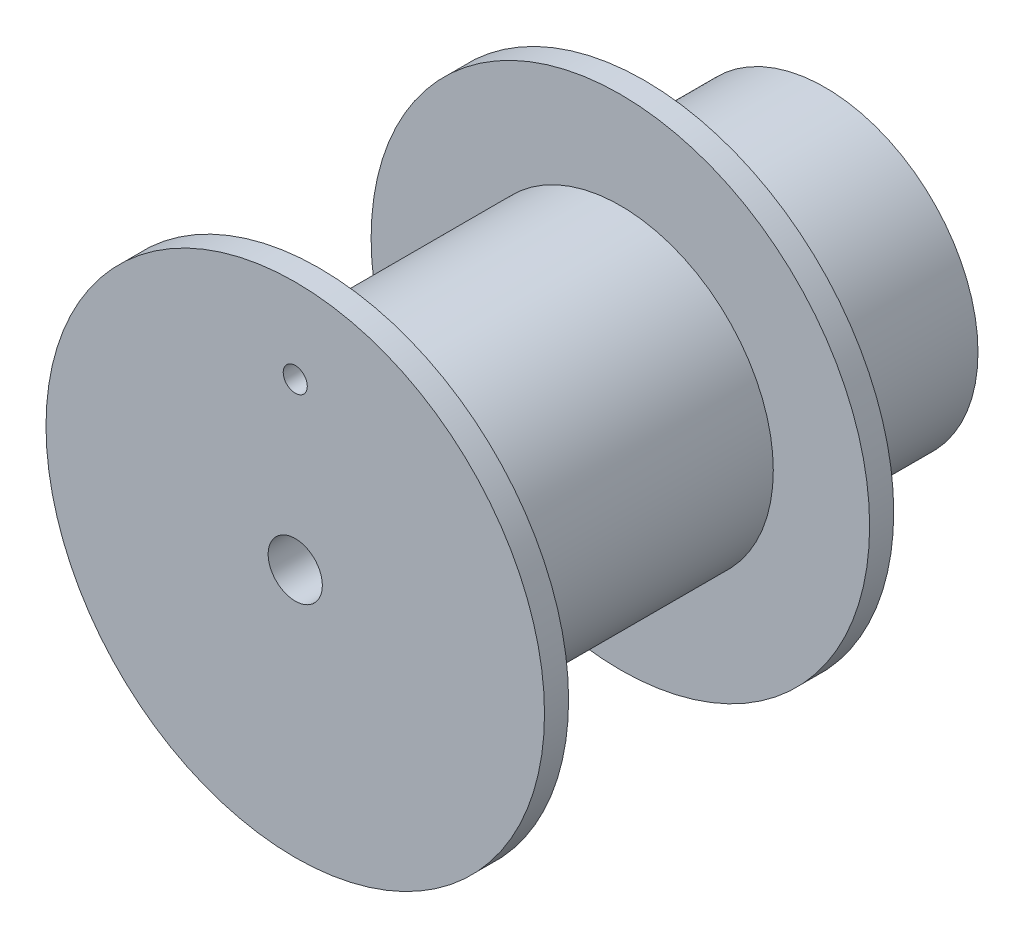
ISO-10303-21;
HEADER;
FILE_DESCRIPTION(('STEP AP214'),'2;1');
FILE_NAME('part.step','',(''),(''),'','','');
FILE_SCHEMA(('AUTOMOTIVE_DESIGN { 1 0 10303 214 1 1 1 1 }'));
ENDSEC;
DATA;
#1=APPLICATION_CONTEXT('core data for automotive mechanical design processes');
#2=APPLICATION_PROTOCOL_DEFINITION('international standard','automotive_design',2000,#1);
#3=PRODUCT_CONTEXT('',#1,'mechanical');
#4=PRODUCT('Part','Part','',(#3));
#5=PRODUCT_RELATED_PRODUCT_CATEGORY('part','',(#4));
#6=PRODUCT_DEFINITION_FORMATION('','',#4);
#7=PRODUCT_DEFINITION_CONTEXT('part definition',#1,'design');
#8=PRODUCT_DEFINITION('design','',#6,#7);
#9=PRODUCT_DEFINITION_SHAPE('','',#8);
#10=(LENGTH_UNIT() NAMED_UNIT(*) SI_UNIT(.MILLI.,.METRE.));
#11=(NAMED_UNIT(*) PLANE_ANGLE_UNIT() SI_UNIT($,.RADIAN.));
#12=(NAMED_UNIT(*) SI_UNIT($,.STERADIAN.) SOLID_ANGLE_UNIT());
#13=UNCERTAINTY_MEASURE_WITH_UNIT(LENGTH_MEASURE(1.E-05),#10,'distance_accuracy_value','');
#14=(GEOMETRIC_REPRESENTATION_CONTEXT(3) GLOBAL_UNCERTAINTY_ASSIGNED_CONTEXT((#13)) GLOBAL_UNIT_ASSIGNED_CONTEXT((#10,
#11,#12)) REPRESENTATION_CONTEXT('',''));
#15=CARTESIAN_POINT('',(0.,0.,0.));
#16=DIRECTION('',(0.,0.,1.));
#17=DIRECTION('',(1.,0.,0.));
#18=AXIS2_PLACEMENT_3D('',#15,#16,#17);
#19=CARTESIAN_POINT('',(0.,0.,28.));
#20=DIRECTION('',(0.,0.,-1.));
#21=DIRECTION('',(-1.,0.,0.));
#22=AXIS2_PLACEMENT_3D('',#19,#20,#21);
#23=CYLINDRICAL_SURFACE('',#22,12.7);
#24=CARTESIAN_POINT('',(0.,0.,17.));
#25=DIRECTION('',(0.,0.,-1.));
#26=DIRECTION('',(-1.,0.,0.));
#27=AXIS2_PLACEMENT_3D('',#24,#25,#26);
#28=CIRCLE('',#27,12.7);
#29=CARTESIAN_POINT('',(-12.7,0.,17.));
#30=VERTEX_POINT('',#29);
#31=EDGE_CURVE('E11',#30,#30,#28,.T.);
#32=ORIENTED_EDGE('',*,*,#31,.F.);
#33=EDGE_LOOP('',(#32));
#34=FACE_BOUND('',#33,.T.);
#35=CARTESIAN_POINT('',(0.,0.,42.));
#36=DIRECTION('',(0.,0.,1.));
#37=DIRECTION('',(1.,0.,0.));
#38=AXIS2_PLACEMENT_3D('',#35,#36,#37);
#39=CIRCLE('',#38,12.7);
#40=CARTESIAN_POINT('',(0.,12.7,42.));
#41=VERTEX_POINT('',#40);
#42=EDGE_CURVE('E88',#41,#41,#39,.T.);
#43=ORIENTED_EDGE('',*,*,#42,.F.);
#44=EDGE_LOOP('',(#43));
#45=FACE_BOUND('',#44,.T.);
#46=ADVANCED_FACE('F43',(#34,#45),#23,.T.);
#47=CARTESIAN_POINT('',(0.,0.,0.));
#48=DIRECTION('',(0.,0.,1.));
#49=DIRECTION('',(1.,0.,0.));
#50=AXIS2_PLACEMENT_3D('',#47,#48,#49);
#51=PLANE('',#50);
#52=CARTESIAN_POINT('',(0.,0.,0.));
#53=DIRECTION('',(0.,0.,1.));
#54=DIRECTION('',(1.,0.,0.));
#55=AXIS2_PLACEMENT_3D('',#52,#53,#54);
#56=CIRCLE('',#55,12.7);
#57=CARTESIAN_POINT('',(12.7,0.,0.));
#58=VERTEX_POINT('',#57);
#59=EDGE_CURVE('E51',#58,#58,#56,.T.);
#60=ORIENTED_EDGE('',*,*,#59,.F.);
#61=EDGE_LOOP('',(#60));
#62=FACE_BOUND('',#61,.T.);
#63=CARTESIAN_POINT('',(0.,0.,0.));
#64=DIRECTION('',(0.,0.,1.));
#65=DIRECTION('',(1.,0.,0.));
#66=AXIS2_PLACEMENT_3D('',#63,#64,#65);
#67=CIRCLE('',#66,7.25);
#68=CARTESIAN_POINT('',(-2.7,6.72848422752108,0.));
#69=VERTEX_POINT('',#68);
#70=CARTESIAN_POINT('',(2.7,6.72848422752108,0.));
#71=VERTEX_POINT('',#70);
#72=EDGE_CURVE('E66',#69,#71,#67,.T.);
#73=ORIENTED_EDGE('',*,*,#72,.T.);
#74=DIRECTION('',(0.,1.,0.));
#75=VECTOR('',#74,1.);
#76=CARTESIAN_POINT('',(2.7,6.72848422752108,0.));
#77=LINE('',#76,#75);
#78=CARTESIAN_POINT('',(2.7,10.5,0.));
#79=VERTEX_POINT('',#78);
#80=EDGE_CURVE('E120',#71,#79,#77,.T.);
#81=ORIENTED_EDGE('',*,*,#80,.T.);
#82=DIRECTION('',(-1.,0.,0.));
#83=VECTOR('',#82,1.);
#84=CARTESIAN_POINT('',(-2.7,10.5,0.));
#85=LINE('',#84,#83);
#86=CARTESIAN_POINT('',(-2.7,10.5,0.));
#87=VERTEX_POINT('',#86);
#88=EDGE_CURVE('E123',#79,#87,#85,.T.);
#89=ORIENTED_EDGE('',*,*,#88,.T.);
#90=DIRECTION('',(0.,-1.,0.));
#91=VECTOR('',#90,1.);
#92=CARTESIAN_POINT('',(-2.7,6.72848422752108,0.));
#93=LINE('',#92,#91);
#94=EDGE_CURVE('E111',#87,#69,#93,.T.);
#95=ORIENTED_EDGE('',*,*,#94,.T.);
#96=EDGE_LOOP('',(#73,#81,#89,#95));
#97=FACE_BOUND('',#96,.T.);
#98=ADVANCED_FACE('F138',(#62,#97),#51,.F.);
#99=CARTESIAN_POINT('',(0.,0.,15.));
#100=DIRECTION('',(0.,0.,-1.));
#101=DIRECTION('',(-1.,0.,0.));
#102=AXIS2_PLACEMENT_3D('',#99,#100,#101);
#103=CIRCLE('',#102,12.7);
#104=CARTESIAN_POINT('',(-12.7,0.,15.));
#105=VERTEX_POINT('',#104);
#106=EDGE_CURVE('E91',#105,#105,#103,.T.);
#107=ORIENTED_EDGE('',*,*,#106,.T.);
#108=EDGE_LOOP('',(#107));
#109=FACE_BOUND('',#108,.T.);
#110=ORIENTED_EDGE('',*,*,#59,.T.);
#111=EDGE_LOOP('',(#110));
#112=FACE_BOUND('',#111,.T.);
#113=ADVANCED_FACE('F45',(#109,#112),#23,.T.);
#114=CARTESIAN_POINT('',(0.,0.,28.));
#115=DIRECTION('',(0.,0.,-1.));
#116=DIRECTION('',(-1.,0.,0.));
#117=AXIS2_PLACEMENT_3D('',#114,#115,#116);
#118=CYLINDRICAL_SURFACE('',#117,7.25);
#119=ORIENTED_EDGE('',*,*,#72,.F.);
#120=DIRECTION('',(0.,0.,-1.));
#121=VECTOR('',#120,1.);
#122=CARTESIAN_POINT('',(-2.7,6.72848422752108,28.));
#123=LINE('',#122,#121);
#124=CARTESIAN_POINT('',(-2.7,6.72848422752108,28.));
#125=VERTEX_POINT('',#124);
#126=EDGE_CURVE('E118',#125,#69,#123,.T.);
#127=ORIENTED_EDGE('',*,*,#126,.F.);
#128=CARTESIAN_POINT('',(0.,0.,28.));
#129=DIRECTION('',(0.,0.,1.));
#130=DIRECTION('',(1.,0.,0.));
#131=AXIS2_PLACEMENT_3D('',#128,#129,#130);
#132=CIRCLE('',#131,7.25);
#133=CARTESIAN_POINT('',(2.7,6.72848422752108,28.));
#134=VERTEX_POINT('',#133);
#135=EDGE_CURVE('E107',#125,#134,#132,.T.);
#136=ORIENTED_EDGE('',*,*,#135,.T.);
#137=DIRECTION('',(0.,0.,-1.));
#138=VECTOR('',#137,1.);
#139=CARTESIAN_POINT('',(2.7,6.72848422752108,28.));
#140=LINE('',#139,#138);
#141=EDGE_CURVE('E133',#134,#71,#140,.T.);
#142=ORIENTED_EDGE('',*,*,#141,.T.);
#143=EDGE_LOOP('',(#119,#127,#136,#142));
#144=FACE_BOUND('',#143,.T.);
#145=ADVANCED_FACE('F145',(#144),#118,.F.);
#146=CARTESIAN_POINT('',(2.7,6.72848422752108,28.));
#147=DIRECTION('',(-1.,0.,0.));
#148=DIRECTION('',(0.,0.,1.));
#149=AXIS2_PLACEMENT_3D('',#146,#147,#148);
#150=PLANE('',#149);
#151=ORIENTED_EDGE('',*,*,#80,.F.);
#152=ORIENTED_EDGE('',*,*,#141,.F.);
#153=DIRECTION('',(0.,1.,0.));
#154=VECTOR('',#153,1.);
#155=CARTESIAN_POINT('',(2.7,6.72848422752108,28.));
#156=LINE('',#155,#154);
#157=CARTESIAN_POINT('',(2.7,10.5,28.));
#158=VERTEX_POINT('',#157);
#159=EDGE_CURVE('E110',#134,#158,#156,.T.);
#160=ORIENTED_EDGE('',*,*,#159,.T.);
#161=DIRECTION('',(0.,0.,-1.));
#162=VECTOR('',#161,1.);
#163=CARTESIAN_POINT('',(2.7,10.5,28.));
#164=LINE('',#163,#162);
#165=EDGE_CURVE('E131',#158,#79,#164,.T.);
#166=ORIENTED_EDGE('',*,*,#165,.T.);
#167=EDGE_LOOP('',(#151,#152,#160,#166));
#168=FACE_BOUND('',#167,.T.);
#169=ADVANCED_FACE('F148',(#168),#150,.T.);
#170=CARTESIAN_POINT('',(-2.7,10.5,28.));
#171=DIRECTION('',(0.,-1.,0.));
#172=DIRECTION('',(0.,0.,-1.));
#173=AXIS2_PLACEMENT_3D('',#170,#171,#172);
#174=PLANE('',#173);
#175=ORIENTED_EDGE('',*,*,#88,.F.);
#176=ORIENTED_EDGE('',*,*,#165,.F.);
#177=DIRECTION('',(-1.,0.,0.));
#178=VECTOR('',#177,1.);
#179=CARTESIAN_POINT('',(-2.7,10.5,28.));
#180=LINE('',#179,#178);
#181=CARTESIAN_POINT('',(-2.7,10.5,28.));
#182=VERTEX_POINT('',#181);
#183=EDGE_CURVE('E114',#158,#182,#180,.T.);
#184=ORIENTED_EDGE('',*,*,#183,.T.);
#185=DIRECTION('',(0.,0.,-1.));
#186=VECTOR('',#185,1.);
#187=CARTESIAN_POINT('',(-2.7,10.5,28.));
#188=LINE('',#187,#186);
#189=EDGE_CURVE('E129',#182,#87,#188,.T.);
#190=ORIENTED_EDGE('',*,*,#189,.T.);
#191=EDGE_LOOP('',(#175,#176,#184,#190));
#192=FACE_BOUND('',#191,.T.);
#193=ADVANCED_FACE('F151',(#192),#174,.T.);
#194=CARTESIAN_POINT('',(-2.7,6.72848422752108,28.));
#195=DIRECTION('',(1.,0.,0.));
#196=DIRECTION('',(0.,0.,-1.));
#197=AXIS2_PLACEMENT_3D('',#194,#195,#196);
#198=PLANE('',#197);
#199=ORIENTED_EDGE('',*,*,#94,.F.);
#200=ORIENTED_EDGE('',*,*,#189,.F.);
#201=DIRECTION('',(0.,-1.,0.));
#202=VECTOR('',#201,1.);
#203=CARTESIAN_POINT('',(-2.7,6.72848422752108,28.));
#204=LINE('',#203,#202);
#205=EDGE_CURVE('E58',#182,#125,#204,.T.);
#206=ORIENTED_EDGE('',*,*,#205,.T.);
#207=ORIENTED_EDGE('',*,*,#126,.T.);
#208=EDGE_LOOP('',(#199,#200,#206,#207));
#209=FACE_BOUND('',#208,.T.);
#210=ADVANCED_FACE('F144',(#209),#198,.T.);
#211=CARTESIAN_POINT('',(0.,0.,17.));
#212=DIRECTION('',(0.,0.,-1.));
#213=DIRECTION('',(-1.,0.,0.));
#214=AXIS2_PLACEMENT_3D('',#211,#212,#213);
#215=CYLINDRICAL_SURFACE('',#214,20.7);
#216=CARTESIAN_POINT('',(0.,0.,17.));
#217=DIRECTION('',(0.,0.,-1.));
#218=DIRECTION('',(-1.,0.,0.));
#219=AXIS2_PLACEMENT_3D('',#216,#217,#218);
#220=CIRCLE('',#219,20.7);
#221=CARTESIAN_POINT('',(-20.7,0.,17.));
#222=VERTEX_POINT('',#221);
#223=EDGE_CURVE('E102',#222,#222,#220,.T.);
#224=ORIENTED_EDGE('',*,*,#223,.T.);
#225=EDGE_LOOP('',(#224));
#226=FACE_BOUND('',#225,.T.);
#227=CARTESIAN_POINT('',(0.,0.,15.));
#228=DIRECTION('',(0.,0.,-1.));
#229=DIRECTION('',(-1.,0.,0.));
#230=AXIS2_PLACEMENT_3D('',#227,#228,#229);
#231=CIRCLE('',#230,20.7);
#232=CARTESIAN_POINT('',(-20.7,0.,15.));
#233=VERTEX_POINT('',#232);
#234=EDGE_CURVE('E95',#233,#233,#231,.T.);
#235=ORIENTED_EDGE('',*,*,#234,.F.);
#236=EDGE_LOOP('',(#235));
#237=FACE_BOUND('',#236,.T.);
#238=ADVANCED_FACE('F220',(#226,#237),#215,.T.);
#239=CARTESIAN_POINT('',(0.,0.,17.));
#240=DIRECTION('',(0.,0.,-1.));
#241=DIRECTION('',(-1.,0.,0.));
#242=AXIS2_PLACEMENT_3D('',#239,#240,#241);
#243=PLANE('',#242);
#244=ORIENTED_EDGE('',*,*,#31,.T.);
#245=EDGE_LOOP('',(#244));
#246=FACE_BOUND('',#245,.T.);
#247=ORIENTED_EDGE('',*,*,#223,.F.);
#248=EDGE_LOOP('',(#247));
#249=FACE_BOUND('',#248,.T.);
#250=ADVANCED_FACE('F216',(#246,#249),#243,.F.);
#251=CARTESIAN_POINT('',(0.,0.,15.));
#252=DIRECTION('',(0.,0.,-1.));
#253=DIRECTION('',(-1.,0.,0.));
#254=AXIS2_PLACEMENT_3D('',#251,#252,#253);
#255=PLANE('',#254);
#256=ORIENTED_EDGE('',*,*,#106,.F.);
#257=EDGE_LOOP('',(#256));
#258=FACE_BOUND('',#257,.T.);
#259=ORIENTED_EDGE('',*,*,#234,.T.);
#260=EDGE_LOOP('',(#259));
#261=FACE_BOUND('',#260,.T.);
#262=ADVANCED_FACE('F156',(#258,#261),#255,.T.);
#263=CARTESIAN_POINT('',(0.,0.,28.));
#264=DIRECTION('',(0.,0.,1.));
#265=DIRECTION('',(1.,0.,0.));
#266=AXIS2_PLACEMENT_3D('',#263,#264,#265);
#267=PLANE('',#266);
#268=ORIENTED_EDGE('',*,*,#159,.F.);
#269=ORIENTED_EDGE('',*,*,#135,.F.);
#270=ORIENTED_EDGE('',*,*,#205,.F.);
#271=ORIENTED_EDGE('',*,*,#183,.F.);
#272=EDGE_LOOP('',(#268,#269,#270,#271));
#273=FACE_BOUND('',#272,.T.);
#274=CARTESIAN_POINT('',(0.,0.,28.));
#275=DIRECTION('',(0.,0.,1.));
#276=DIRECTION('',(1.,0.,0.));
#277=AXIS2_PLACEMENT_3D('',#274,#275,#276);
#278=CIRCLE('',#277,2.25);
#279=CARTESIAN_POINT('',(2.25,0.,28.));
#280=VERTEX_POINT('',#279);
#281=EDGE_CURVE('E92',#280,#280,#278,.T.);
#282=ORIENTED_EDGE('',*,*,#281,.T.);
#283=EDGE_LOOP('',(#282));
#284=FACE_BOUND('',#283,.T.);
#285=ADVANCED_FACE('F152',(#273,#284),#267,.F.);
#286=CARTESIAN_POINT('',(0.,0.,42.));
#287=DIRECTION('',(0.,0.,-1.));
#288=DIRECTION('',(-1.,0.,0.));
#289=AXIS2_PLACEMENT_3D('',#286,#287,#288);
#290=CYLINDRICAL_SURFACE('',#289,2.25);
#291=ORIENTED_EDGE('',*,*,#281,.F.);
#292=EDGE_LOOP('',(#291));
#293=FACE_BOUND('',#292,.T.);
#294=CARTESIAN_POINT('',(0.,0.,44.));
#295=DIRECTION('',(0.,0.,1.));
#296=DIRECTION('',(1.,0.,0.));
#297=AXIS2_PLACEMENT_3D('',#294,#295,#296);
#298=CIRCLE('',#297,2.25);
#299=CARTESIAN_POINT('',(2.25,0.,44.));
#300=VERTEX_POINT('',#299);
#301=EDGE_CURVE('E166',#300,#300,#298,.T.);
#302=ORIENTED_EDGE('',*,*,#301,.T.);
#303=EDGE_LOOP('',(#302));
#304=FACE_BOUND('',#303,.T.);
#305=ADVANCED_FACE('F155',(#293,#304),#290,.F.);
#306=CARTESIAN_POINT('',(0.,0.,44.));
#307=DIRECTION('',(0.,0.,1.));
#308=DIRECTION('',(1.,0.,0.));
#309=AXIS2_PLACEMENT_3D('',#306,#307,#308);
#310=PLANE('',#309);
#311=ORIENTED_EDGE('',*,*,#301,.F.);
#312=EDGE_LOOP('',(#311));
#313=FACE_BOUND('',#312,.T.);
#314=CARTESIAN_POINT('',(0.,0.,44.));
#315=DIRECTION('',(0.,0.,1.));
#316=DIRECTION('',(1.,0.,0.));
#317=AXIS2_PLACEMENT_3D('',#314,#315,#316);
#318=CIRCLE('',#317,20.7);
#319=CARTESIAN_POINT('',(20.7,0.,44.));
#320=VERTEX_POINT('',#319);
#321=EDGE_CURVE('E98',#320,#320,#318,.T.);
#322=ORIENTED_EDGE('',*,*,#321,.T.);
#323=EDGE_LOOP('',(#322));
#324=FACE_BOUND('',#323,.T.);
#325=CARTESIAN_POINT('',(0.,13.7,44.));
#326=DIRECTION('',(0.,0.,1.));
#327=DIRECTION('',(1.,0.,0.));
#328=AXIS2_PLACEMENT_3D('',#325,#326,#327);
#329=CIRCLE('',#328,1.);
#330=CARTESIAN_POINT('',(1.,13.7,44.));
#331=VERTEX_POINT('',#330);
#332=EDGE_CURVE('E169',#331,#331,#329,.T.);
#333=ORIENTED_EDGE('',*,*,#332,.F.);
#334=EDGE_LOOP('',(#333));
#335=FACE_BOUND('',#334,.T.);
#336=ADVANCED_FACE('F162',(#313,#324,#335),#310,.T.);
#337=CARTESIAN_POINT('',(0.,0.,42.));
#338=DIRECTION('',(0.,0.,1.));
#339=DIRECTION('',(1.,0.,0.));
#340=AXIS2_PLACEMENT_3D('',#337,#338,#339);
#341=PLANE('',#340);
#342=CARTESIAN_POINT('',(0.,0.,42.));
#343=DIRECTION('',(0.,0.,1.));
#344=DIRECTION('',(1.,0.,0.));
#345=AXIS2_PLACEMENT_3D('',#342,#343,#344);
#346=CIRCLE('',#345,20.7);
#347=CARTESIAN_POINT('',(20.7,0.,42.));
#348=VERTEX_POINT('',#347);
#349=EDGE_CURVE('E168',#348,#348,#346,.T.);
#350=ORIENTED_EDGE('',*,*,#349,.F.);
#351=EDGE_LOOP('',(#350));
#352=FACE_BOUND('',#351,.T.);
#353=CARTESIAN_POINT('',(0.,13.7,42.));
#354=DIRECTION('',(0.,0.,1.));
#355=DIRECTION('',(1.,0.,0.));
#356=AXIS2_PLACEMENT_3D('',#353,#354,#355);
#357=CIRCLE('',#356,1.);
#358=EDGE_CURVE('E173',#41,#41,#357,.T.);
#359=ORIENTED_EDGE('',*,*,#358,.T.);
#360=ORIENTED_EDGE('',*,*,#42,.T.);
#361=EDGE_LOOP('',(#359,#360));
#362=FACE_BOUND('',#361,.T.);
#363=ADVANCED_FACE('F186',(#352,#362),#341,.F.);
#364=CARTESIAN_POINT('',(0.,0.,44.));
#365=DIRECTION('',(0.,0.,-1.));
#366=DIRECTION('',(-1.,0.,0.));
#367=AXIS2_PLACEMENT_3D('',#364,#365,#366);
#368=CYLINDRICAL_SURFACE('',#367,20.7);
#369=ORIENTED_EDGE('',*,*,#321,.F.);
#370=EDGE_LOOP('',(#369));
#371=FACE_BOUND('',#370,.T.);
#372=ORIENTED_EDGE('',*,*,#349,.T.);
#373=EDGE_LOOP('',(#372));
#374=FACE_BOUND('',#373,.T.);
#375=ADVANCED_FACE('F182',(#371,#374),#368,.T.);
#376=CARTESIAN_POINT('',(0.,13.7,44.));
#377=DIRECTION('',(0.,0.,-1.));
#378=DIRECTION('',(-1.,0.,0.));
#379=AXIS2_PLACEMENT_3D('',#376,#377,#378);
#380=CYLINDRICAL_SURFACE('',#379,1.);
#381=ORIENTED_EDGE('',*,*,#332,.T.);
#382=EDGE_LOOP('',(#381));
#383=FACE_BOUND('',#382,.T.);
#384=ORIENTED_EDGE('',*,*,#358,.F.);
#385=EDGE_LOOP('',(#384));
#386=FACE_BOUND('',#385,.T.);
#387=ADVANCED_FACE('F185',(#383,#386),#380,.F.);
#388=CLOSED_SHELL('',(#46,#98,#113,#145,#169,#193,#210,#238,#250,#262,#285,#305,#336,#363,#375,#387));
#389=MANIFOLD_SOLID_BREP('B2',#388);
#390=ADVANCED_BREP_SHAPE_REPRESENTATION('',(#18,#389),#14);
#391=SHAPE_DEFINITION_REPRESENTATION(#9,#390);
ENDSEC;
END-ISO-10303-21;
